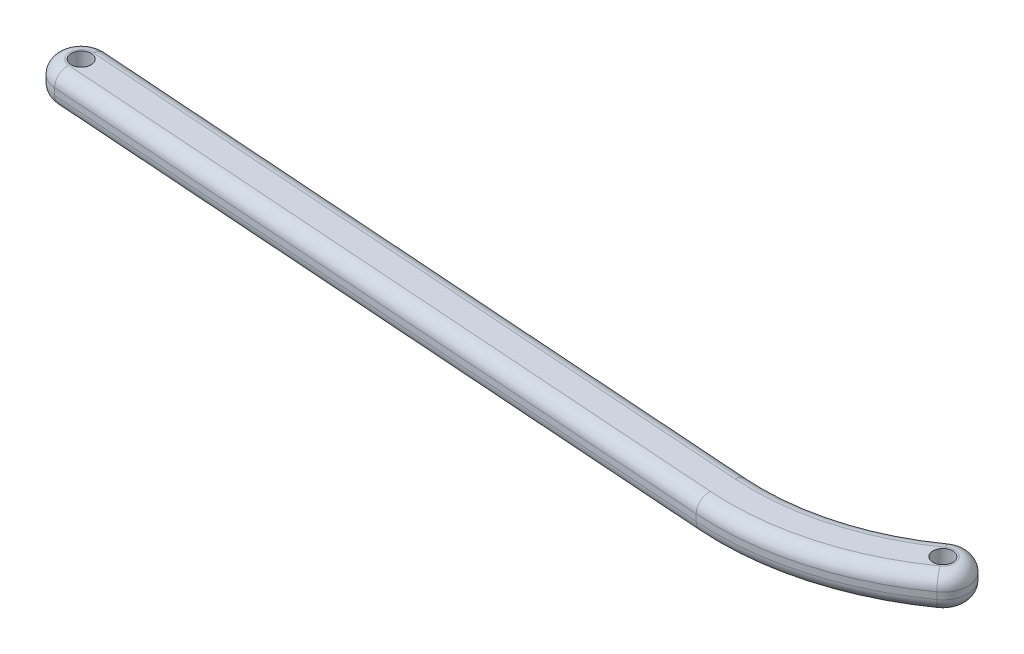
ISO-10303-21;
HEADER;
FILE_DESCRIPTION(('STEP AP214'),'2;1');
FILE_NAME('part.step','',(''),(''),'','','');
FILE_SCHEMA(('AUTOMOTIVE_DESIGN { 1 0 10303 214 1 1 1 1 }'));
ENDSEC;
DATA;
#1=APPLICATION_CONTEXT('core data for automotive mechanical design processes');
#2=APPLICATION_PROTOCOL_DEFINITION('international standard','automotive_design',2000,#1);
#3=PRODUCT_CONTEXT('',#1,'mechanical');
#4=PRODUCT('Part','Part','',(#3));
#5=PRODUCT_RELATED_PRODUCT_CATEGORY('part','',(#4));
#6=PRODUCT_DEFINITION_FORMATION('','',#4);
#7=PRODUCT_DEFINITION_CONTEXT('part definition',#1,'design');
#8=PRODUCT_DEFINITION('design','',#6,#7);
#9=PRODUCT_DEFINITION_SHAPE('','',#8);
#10=(LENGTH_UNIT() NAMED_UNIT(*) SI_UNIT(.MILLI.,.METRE.));
#11=(NAMED_UNIT(*) PLANE_ANGLE_UNIT() SI_UNIT($,.RADIAN.));
#12=(NAMED_UNIT(*) SI_UNIT($,.STERADIAN.) SOLID_ANGLE_UNIT());
#13=UNCERTAINTY_MEASURE_WITH_UNIT(LENGTH_MEASURE(1.E-05),#10,'distance_accuracy_value','');
#14=(GEOMETRIC_REPRESENTATION_CONTEXT(3) GLOBAL_UNCERTAINTY_ASSIGNED_CONTEXT((#13)) GLOBAL_UNIT_ASSIGNED_CONTEXT((#10,
#11,#12)) REPRESENTATION_CONTEXT('',''));
#15=CARTESIAN_POINT('',(0.,0.,0.));
#16=DIRECTION('',(0.,0.,1.));
#17=DIRECTION('',(1.,0.,0.));
#18=AXIS2_PLACEMENT_3D('',#15,#16,#17);
#19=CARTESIAN_POINT('',(0.,5.,0.));
#20=DIRECTION('',(0.,1.,0.));
#21=DIRECTION('',(0.,0.,1.));
#22=AXIS2_PLACEMENT_3D('',#19,#20,#21);
#23=PLANE('',#22);
#24=DIRECTION('',(0.997564050259824,0.,0.0697564737441255));
#25=VECTOR('',#24,1.);
#26=CARTESIAN_POINT('',(-52.1097951829249,5.,18.0456459004256));
#27=LINE('',#26,#25);
#28=CARTESIAN_POINT('',(-260.244147658104,5.,3.49147417590938));
#29=VERTEX_POINT('',#28);
#30=CARTESIAN_POINT('',(-52.1097951829248,5.,18.0456459004256));
#31=VERTEX_POINT('',#30);
#32=EDGE_CURVE('E60',#29,#31,#27,.T.);
#33=ORIENTED_EDGE('',*,*,#32,.T.);
#34=CARTESIAN_POINT('',(-46.2851296252904,5.,-65.2509522962697));
#35=DIRECTION('',(0.,1.,0.));
#36=DIRECTION('',(0.,0.,1.));
#37=AXIS2_PLACEMENT_3D('',#34,#35,#36);
#38=CIRCLE('',#37,83.5);
#39=CARTESIAN_POINT('',(2.02497442110648,5.,2.8547291629618));
#40=VERTEX_POINT('',#39);
#41=EDGE_CURVE('E143',#31,#40,#38,.T.);
#42=ORIENTED_EDGE('',*,*,#41,.T.);
#43=CARTESIAN_POINT('',(0.,5.,0.));
#44=DIRECTION('',(0.,1.,0.));
#45=DIRECTION('',(0.,0.,1.));
#46=AXIS2_PLACEMENT_3D('',#43,#44,#45);
#47=CIRCLE('',#46,3.50000000000001);
#48=CARTESIAN_POINT('',(-2.02497442110647,5.,-2.8547291629618));
#49=VERTEX_POINT('',#48);
#50=EDGE_CURVE('E167',#40,#49,#47,.T.);
#51=ORIENTED_EDGE('',*,*,#50,.T.);
#52=CARTESIAN_POINT('',(-46.2851296252904,5.,-65.2509522962697));
#53=DIRECTION('',(0.,1.,0.));
#54=DIRECTION('',(0.,0.,1.));
#55=AXIS2_PLACEMENT_3D('',#52,#53,#54);
#56=CIRCLE('',#55,76.5);
#57=CARTESIAN_POINT('',(-51.6214998667159,5.,11.0626975486069));
#58=VERTEX_POINT('',#57);
#59=EDGE_CURVE('E269',#49,#58,#56,.F.);
#60=ORIENTED_EDGE('',*,*,#59,.T.);
#61=DIRECTION('',(-0.997564050259824,0.,-0.0697564737441254));
#62=VECTOR('',#61,1.);
#63=CARTESIAN_POINT('',(-259.755852341896,5.,-3.49147417590938));
#64=LINE('',#63,#62);
#65=CARTESIAN_POINT('',(-259.755852341896,5.,-3.49147417590938));
#66=VERTEX_POINT('',#65);
#67=EDGE_CURVE('E271',#58,#66,#64,.T.);
#68=ORIENTED_EDGE('',*,*,#67,.T.);
#69=CARTESIAN_POINT('',(-260.,5.,0.));
#70=DIRECTION('',(0.,1.,0.));
#71=DIRECTION('',(0.,0.,1.));
#72=AXIS2_PLACEMENT_3D('',#69,#70,#71);
#73=CIRCLE('',#72,3.49999999999999);
#74=EDGE_CURVE('E65',#66,#29,#73,.T.);
#75=ORIENTED_EDGE('',*,*,#74,.T.);
#76=EDGE_LOOP('',(#33,#42,#51,#60,#68,#75));
#77=FACE_BOUND('',#76,.T.);
#78=CARTESIAN_POINT('',(0.,5.,0.));
#79=DIRECTION('',(0.,1.,0.));
#80=DIRECTION('',(0.,0.,1.));
#81=AXIS2_PLACEMENT_3D('',#78,#79,#80);
#82=CIRCLE('',#81,3.);
#83=CARTESIAN_POINT('',(0.,5.,3.));
#84=VERTEX_POINT('',#83);
#85=EDGE_CURVE('E156',#84,#84,#82,.T.);
#86=ORIENTED_EDGE('',*,*,#85,.F.);
#87=EDGE_LOOP('',(#86));
#88=FACE_BOUND('',#87,.T.);
#89=CARTESIAN_POINT('',(-260.,5.,0.));
#90=DIRECTION('',(0.,1.,0.));
#91=DIRECTION('',(0.,0.,1.));
#92=AXIS2_PLACEMENT_3D('',#89,#90,#91);
#93=CIRCLE('',#92,2.99999999999999);
#94=CARTESIAN_POINT('',(-260.,5.,2.99999999999999));
#95=VERTEX_POINT('',#94);
#96=EDGE_CURVE('E215',#95,#95,#93,.T.);
#97=ORIENTED_EDGE('',*,*,#96,.F.);
#98=EDGE_LOOP('',(#97));
#99=FACE_BOUND('',#98,.T.);
#100=ADVANCED_FACE('F43',(#77,#88,#99),#23,.T.);
#101=CARTESIAN_POINT('',(0.,-5.,0.));
#102=DIRECTION('',(0.,1.,0.));
#103=DIRECTION('',(0.,0.,1.));
#104=AXIS2_PLACEMENT_3D('',#101,#102,#103);
#105=PLANE('',#104);
#106=CARTESIAN_POINT('',(0.,-5.,0.));
#107=DIRECTION('',(0.,1.,0.));
#108=DIRECTION('',(0.,0.,1.));
#109=AXIS2_PLACEMENT_3D('',#106,#107,#108);
#110=CIRCLE('',#109,3.50000000000001);
#111=CARTESIAN_POINT('',(-2.02497442110647,-5.,-2.8547291629618));
#112=VERTEX_POINT('',#111);
#113=CARTESIAN_POINT('',(2.02497442110648,-5.,2.8547291629618));
#114=VERTEX_POINT('',#113);
#115=EDGE_CURVE('E239',#112,#114,#110,.F.);
#116=ORIENTED_EDGE('',*,*,#115,.T.);
#117=CARTESIAN_POINT('',(-46.2851296252904,-5.,-65.2509522962697));
#118=DIRECTION('',(0.,1.,0.));
#119=DIRECTION('',(0.,0.,1.));
#120=AXIS2_PLACEMENT_3D('',#117,#118,#119);
#121=CIRCLE('',#120,83.5);
#122=CARTESIAN_POINT('',(-52.1097951829248,-5.,18.0456459004256));
#123=VERTEX_POINT('',#122);
#124=EDGE_CURVE('E249',#114,#123,#121,.F.);
#125=ORIENTED_EDGE('',*,*,#124,.T.);
#126=DIRECTION('',(0.997564050259824,0.,0.0697564737441255));
#127=VECTOR('',#126,1.);
#128=CARTESIAN_POINT('',(-1.50929872170031,-5.,21.5839773007179));
#129=LINE('',#128,#127);
#130=CARTESIAN_POINT('',(-260.244147658104,-5.,3.49147417590938));
#131=VERTEX_POINT('',#130);
#132=EDGE_CURVE('E247',#123,#131,#129,.F.);
#133=ORIENTED_EDGE('',*,*,#132,.T.);
#134=CARTESIAN_POINT('',(-260.,-5.,0.));
#135=DIRECTION('',(0.,1.,0.));
#136=DIRECTION('',(0.,0.,1.));
#137=AXIS2_PLACEMENT_3D('',#134,#135,#136);
#138=CIRCLE('',#137,3.49999999999999);
#139=CARTESIAN_POINT('',(-259.755852341896,-5.,-3.49147417590938));
#140=VERTEX_POINT('',#139);
#141=EDGE_CURVE('E245',#131,#140,#138,.F.);
#142=ORIENTED_EDGE('',*,*,#141,.T.);
#143=DIRECTION('',(-0.997564050259824,0.,-0.0697564737441254));
#144=VECTOR('',#143,1.);
#145=CARTESIAN_POINT('',(-1.02100340549142,-5.,14.6010289488992));
#146=LINE('',#145,#144);
#147=CARTESIAN_POINT('',(-51.6214998667159,-5.,11.0626975486069));
#148=VERTEX_POINT('',#147);
#149=EDGE_CURVE('E243',#140,#148,#146,.F.);
#150=ORIENTED_EDGE('',*,*,#149,.T.);
#151=CARTESIAN_POINT('',(-46.2851296252904,-5.,-65.2509522962697));
#152=DIRECTION('',(0.,1.,0.));
#153=DIRECTION('',(0.,0.,1.));
#154=AXIS2_PLACEMENT_3D('',#151,#152,#153);
#155=CIRCLE('',#154,76.5);
#156=EDGE_CURVE('E241',#148,#112,#155,.T.);
#157=ORIENTED_EDGE('',*,*,#156,.T.);
#158=EDGE_LOOP('',(#116,#125,#133,#142,#150,#157));
#159=FACE_BOUND('',#158,.T.);
#160=CARTESIAN_POINT('',(0.,-5.,0.));
#161=DIRECTION('',(0.,1.,0.));
#162=DIRECTION('',(0.,0.,1.));
#163=AXIS2_PLACEMENT_3D('',#160,#161,#162);
#164=CIRCLE('',#163,3.);
#165=CARTESIAN_POINT('',(0.,-5.,3.));
#166=VERTEX_POINT('',#165);
#167=EDGE_CURVE('E220',#166,#166,#164,.T.);
#168=ORIENTED_EDGE('',*,*,#167,.T.);
#169=EDGE_LOOP('',(#168));
#170=FACE_BOUND('',#169,.T.);
#171=CARTESIAN_POINT('',(-260.,-5.,0.));
#172=DIRECTION('',(0.,1.,0.));
#173=DIRECTION('',(0.,0.,1.));
#174=AXIS2_PLACEMENT_3D('',#171,#172,#173);
#175=CIRCLE('',#174,2.99999999999999);
#176=CARTESIAN_POINT('',(-260.,-5.,2.99999999999999));
#177=VERTEX_POINT('',#176);
#178=EDGE_CURVE('E209',#177,#177,#175,.T.);
#179=ORIENTED_EDGE('',*,*,#178,.T.);
#180=EDGE_LOOP('',(#179));
#181=FACE_BOUND('',#180,.T.);
#182=ADVANCED_FACE('F313',(#159,#170,#181),#105,.F.);
#183=CARTESIAN_POINT('',(0.,5.,0.));
#184=DIRECTION('',(0.,-1.,0.));
#185=DIRECTION('',(0.,0.,-1.));
#186=AXIS2_PLACEMENT_3D('',#183,#184,#185);
#187=CYLINDRICAL_SURFACE('',#186,7.50000000000001);
#188=DIRECTION('',(0.,-1.,0.));
#189=VECTOR('',#188,1.);
#190=CARTESIAN_POINT('',(4.33923090237101,5.,6.11727677777531));
#191=LINE('',#190,#189);
#192=CARTESIAN_POINT('',(4.33923090237101,1.,6.11727677777531));
#193=VERTEX_POINT('',#192);
#194=CARTESIAN_POINT('',(4.33923090237101,-1.,6.11727677777531));
#195=VERTEX_POINT('',#194);
#196=EDGE_CURVE('E136',#193,#195,#191,.T.);
#197=ORIENTED_EDGE('',*,*,#196,.T.);
#198=CARTESIAN_POINT('',(0.,-1.,0.));
#199=DIRECTION('',(0.,1.,0.));
#200=DIRECTION('',(0.,0.,1.));
#201=AXIS2_PLACEMENT_3D('',#198,#199,#200);
#202=CIRCLE('',#201,7.50000000000001);
#203=CARTESIAN_POINT('',(-4.33923090237097,-1.,-6.11727677777527));
#204=VERTEX_POINT('',#203);
#205=EDGE_CURVE('E11',#195,#204,#202,.T.);
#206=ORIENTED_EDGE('',*,*,#205,.T.);
#207=DIRECTION('',(0.,-1.,0.));
#208=VECTOR('',#207,1.);
#209=CARTESIAN_POINT('',(-4.33923090237097,5.,-6.11727677777527));
#210=LINE('',#209,#208);
#211=CARTESIAN_POINT('',(-4.33923090237097,1.,-6.11727677777527));
#212=VERTEX_POINT('',#211);
#213=EDGE_CURVE('E138',#212,#204,#210,.T.);
#214=ORIENTED_EDGE('',*,*,#213,.F.);
#215=CARTESIAN_POINT('',(0.,1.,0.));
#216=DIRECTION('',(0.,1.,0.));
#217=DIRECTION('',(0.,0.,1.));
#218=AXIS2_PLACEMENT_3D('',#215,#216,#217);
#219=CIRCLE('',#218,7.50000000000001);
#220=EDGE_CURVE('E52',#212,#193,#219,.F.);
#221=ORIENTED_EDGE('',*,*,#220,.T.);
#222=EDGE_LOOP('',(#197,#206,#214,#221));
#223=FACE_BOUND('',#222,.T.);
#224=ADVANCED_FACE('F135',(#223),#187,.T.);
#225=CARTESIAN_POINT('',(-46.2851296252904,5.,-65.2509522962697));
#226=DIRECTION('',(0.,-1.,0.));
#227=DIRECTION('',(0.,0.,-1.));
#228=AXIS2_PLACEMENT_3D('',#225,#226,#227);
#229=CYLINDRICAL_SURFACE('',#228,72.5);
#230=ORIENTED_EDGE('',*,*,#213,.T.);
#231=CARTESIAN_POINT('',(-46.2851296252904,-1.,-65.2509522962697));
#232=DIRECTION('',(0.,1.,0.));
#233=DIRECTION('',(0.,0.,1.));
#234=AXIS2_PLACEMENT_3D('',#231,#232,#233);
#235=CIRCLE('',#234,72.5);
#236=CARTESIAN_POINT('',(-51.3424739717394,-1.,7.07244134756756));
#237=VERTEX_POINT('',#236);
#238=EDGE_CURVE('E266',#204,#237,#235,.F.);
#239=ORIENTED_EDGE('',*,*,#238,.T.);
#240=DIRECTION('',(0.,-1.,0.));
#241=VECTOR('',#240,1.);
#242=CARTESIAN_POINT('',(-51.3424739717394,5.,7.07244134756756));
#243=LINE('',#242,#241);
#244=CARTESIAN_POINT('',(-51.3424739717394,1.,7.07244134756756));
#245=VERTEX_POINT('',#244);
#246=EDGE_CURVE('E234',#245,#237,#243,.T.);
#247=ORIENTED_EDGE('',*,*,#246,.F.);
#248=CARTESIAN_POINT('',(-46.2851296252904,1.,-65.2509522962697));
#249=DIRECTION('',(0.,1.,0.));
#250=DIRECTION('',(0.,0.,1.));
#251=AXIS2_PLACEMENT_3D('',#248,#249,#250);
#252=CIRCLE('',#251,72.5);
#253=EDGE_CURVE('E264',#245,#212,#252,.T.);
#254=ORIENTED_EDGE('',*,*,#253,.T.);
#255=EDGE_LOOP('',(#230,#239,#247,#254));
#256=FACE_BOUND('',#255,.T.);
#257=ADVANCED_FACE('F280',(#256),#229,.F.);
#258=CARTESIAN_POINT('',(-51.3424739717395,5.,7.07244134756754));
#259=DIRECTION('',(-0.0697564737441254,0.,0.997564050259824));
#260=DIRECTION('',(0.997564050259824,0.,0.0697564737441254));
#261=AXIS2_PLACEMENT_3D('',#258,#259,#260);
#262=PLANE('',#261);
#263=ORIENTED_EDGE('',*,*,#246,.T.);
#264=DIRECTION('',(-0.997564050259824,0.,-0.0697564737441254));
#265=VECTOR('',#264,1.);
#266=CARTESIAN_POINT('',(-51.3424739717395,-1.,7.07244134756754));
#267=LINE('',#266,#265);
#268=CARTESIAN_POINT('',(-259.476826446919,-1.,-7.48173037694868));
#269=VERTEX_POINT('',#268);
#270=EDGE_CURVE('E262',#237,#269,#267,.T.);
#271=ORIENTED_EDGE('',*,*,#270,.T.);
#272=DIRECTION('',(0.,-1.,0.));
#273=VECTOR('',#272,1.);
#274=CARTESIAN_POINT('',(-259.476826446919,5.,-7.48173037694868));
#275=LINE('',#274,#273);
#276=CARTESIAN_POINT('',(-259.476826446919,1.,-7.48173037694868));
#277=VERTEX_POINT('',#276);
#278=EDGE_CURVE('E231',#277,#269,#275,.T.);
#279=ORIENTED_EDGE('',*,*,#278,.F.);
#280=DIRECTION('',(-0.997564050259824,0.,-0.0697564737441254));
#281=VECTOR('',#280,1.);
#282=CARTESIAN_POINT('',(-51.3424739717394,1.,7.07244134756754));
#283=LINE('',#282,#281);
#284=EDGE_CURVE('E260',#277,#245,#283,.F.);
#285=ORIENTED_EDGE('',*,*,#284,.T.);
#286=EDGE_LOOP('',(#263,#271,#279,#285));
#287=FACE_BOUND('',#286,.T.);
#288=ADVANCED_FACE('F331',(#287),#262,.F.);
#289=CARTESIAN_POINT('',(-260.,5.,0.));
#290=DIRECTION('',(0.,-1.,0.));
#291=DIRECTION('',(0.,0.,-1.));
#292=AXIS2_PLACEMENT_3D('',#289,#290,#291);
#293=CYLINDRICAL_SURFACE('',#292,7.49999999999999);
#294=ORIENTED_EDGE('',*,*,#278,.T.);
#295=CARTESIAN_POINT('',(-260.,-1.,0.));
#296=DIRECTION('',(0.,1.,0.));
#297=DIRECTION('',(0.,0.,1.));
#298=AXIS2_PLACEMENT_3D('',#295,#296,#297);
#299=CIRCLE('',#298,7.49999999999999);
#300=CARTESIAN_POINT('',(-260.523173553081,-1.,7.48173037694868));
#301=VERTEX_POINT('',#300);
#302=EDGE_CURVE('E258',#269,#301,#299,.T.);
#303=ORIENTED_EDGE('',*,*,#302,.T.);
#304=DIRECTION('',(0.,-1.,0.));
#305=VECTOR('',#304,1.);
#306=CARTESIAN_POINT('',(-260.523173553081,5.,7.48173037694868));
#307=LINE('',#306,#305);
#308=CARTESIAN_POINT('',(-260.523173553081,1.,7.48173037694868));
#309=VERTEX_POINT('',#308);
#310=EDGE_CURVE('E228',#309,#301,#307,.T.);
#311=ORIENTED_EDGE('',*,*,#310,.F.);
#312=CARTESIAN_POINT('',(-260.,1.,0.));
#313=DIRECTION('',(0.,1.,0.));
#314=DIRECTION('',(0.,0.,1.));
#315=AXIS2_PLACEMENT_3D('',#312,#313,#314);
#316=CIRCLE('',#315,7.49999999999999);
#317=EDGE_CURVE('E256',#309,#277,#316,.F.);
#318=ORIENTED_EDGE('',*,*,#317,.T.);
#319=EDGE_LOOP('',(#294,#303,#311,#318));
#320=FACE_BOUND('',#319,.T.);
#321=ADVANCED_FACE('F293',(#320),#293,.T.);
#322=CARTESIAN_POINT('',(-52.3888210779013,5.,22.0359021014649));
#323=DIRECTION('',(0.0697564737441255,0.,-0.997564050259824));
#324=DIRECTION('',(-0.997564050259824,0.,-0.0697564737441255));
#325=AXIS2_PLACEMENT_3D('',#322,#323,#324);
#326=PLANE('',#325);
#327=ORIENTED_EDGE('',*,*,#310,.T.);
#328=DIRECTION('',(0.997564050259824,0.,0.0697564737441255));
#329=VECTOR('',#328,1.);
#330=CARTESIAN_POINT('',(-52.3888210779013,-1.,22.0359021014649));
#331=LINE('',#330,#329);
#332=CARTESIAN_POINT('',(-52.3888210779013,-1.,22.0359021014649));
#333=VERTEX_POINT('',#332);
#334=EDGE_CURVE('E254',#301,#333,#331,.T.);
#335=ORIENTED_EDGE('',*,*,#334,.T.);
#336=DIRECTION('',(0.,-1.,0.));
#337=VECTOR('',#336,1.);
#338=CARTESIAN_POINT('',(-52.3888210779013,5.,22.0359021014649));
#339=LINE('',#338,#337);
#340=CARTESIAN_POINT('',(-52.3888210779013,1.,22.0359021014649));
#341=VERTEX_POINT('',#340);
#342=EDGE_CURVE('E155',#341,#333,#339,.T.);
#343=ORIENTED_EDGE('',*,*,#342,.F.);
#344=DIRECTION('',(0.997564050259824,0.,0.0697564737441255));
#345=VECTOR('',#344,1.);
#346=CARTESIAN_POINT('',(-260.523173553081,1.,7.48173037694867));
#347=LINE('',#346,#345);
#348=EDGE_CURVE('E252',#341,#309,#347,.F.);
#349=ORIENTED_EDGE('',*,*,#348,.T.);
#350=EDGE_LOOP('',(#327,#335,#343,#349));
#351=FACE_BOUND('',#350,.T.);
#352=ADVANCED_FACE('F290',(#351),#326,.F.);
#353=CARTESIAN_POINT('',(-46.2851296252904,5.,-65.2509522962697));
#354=DIRECTION('',(0.,-1.,0.));
#355=DIRECTION('',(0.,0.,-1.));
#356=AXIS2_PLACEMENT_3D('',#353,#354,#355);
#357=CYLINDRICAL_SURFACE('',#356,87.5000000000001);
#358=ORIENTED_EDGE('',*,*,#342,.T.);
#359=CARTESIAN_POINT('',(-46.2851296252904,-1.,-65.2509522962697));
#360=DIRECTION('',(0.,1.,0.));
#361=DIRECTION('',(0.,0.,1.));
#362=AXIS2_PLACEMENT_3D('',#359,#360,#361);
#363=CIRCLE('',#362,87.5000000000001);
#364=EDGE_CURVE('E154',#333,#195,#363,.T.);
#365=ORIENTED_EDGE('',*,*,#364,.T.);
#366=ORIENTED_EDGE('',*,*,#196,.F.);
#367=CARTESIAN_POINT('',(-46.2851296252904,1.,-65.2509522962697));
#368=DIRECTION('',(0.,1.,0.));
#369=DIRECTION('',(0.,0.,1.));
#370=AXIS2_PLACEMENT_3D('',#367,#368,#369);
#371=CIRCLE('',#370,87.5000000000001);
#372=EDGE_CURVE('E151',#193,#341,#371,.F.);
#373=ORIENTED_EDGE('',*,*,#372,.T.);
#374=EDGE_LOOP('',(#358,#365,#366,#373));
#375=FACE_BOUND('',#374,.T.);
#376=ADVANCED_FACE('F150',(#375),#357,.T.);
#377=CARTESIAN_POINT('',(0.,5.,0.));
#378=DIRECTION('',(0.,-1.,0.));
#379=DIRECTION('',(0.,0.,-1.));
#380=AXIS2_PLACEMENT_3D('',#377,#378,#379);
#381=CYLINDRICAL_SURFACE('',#380,3.);
#382=ORIENTED_EDGE('',*,*,#85,.T.);
#383=EDGE_LOOP('',(#382));
#384=FACE_BOUND('',#383,.T.);
#385=ORIENTED_EDGE('',*,*,#167,.F.);
#386=EDGE_LOOP('',(#385));
#387=FACE_BOUND('',#386,.T.);
#388=ADVANCED_FACE('F322',(#384,#387),#381,.F.);
#389=CARTESIAN_POINT('',(-260.,5.,0.));
#390=DIRECTION('',(0.,-1.,0.));
#391=DIRECTION('',(0.,0.,-1.));
#392=AXIS2_PLACEMENT_3D('',#389,#390,#391);
#393=CYLINDRICAL_SURFACE('',#392,2.99999999999999);
#394=ORIENTED_EDGE('',*,*,#96,.T.);
#395=EDGE_LOOP('',(#394));
#396=FACE_BOUND('',#395,.T.);
#397=ORIENTED_EDGE('',*,*,#178,.F.);
#398=EDGE_LOOP('',(#397));
#399=FACE_BOUND('',#398,.T.);
#400=ADVANCED_FACE('F374',(#396,#399),#393,.F.);
#401=CARTESIAN_POINT('',(-51.621499866716,-1.,11.0626975486068));
#402=DIRECTION('',(-0.997564050259824,0.,-0.0697564737441254));
#403=DIRECTION('',(-0.0697564737441254,0.,0.997564050259824));
#404=AXIS2_PLACEMENT_3D('',#401,#402,#403);
#405=CYLINDRICAL_SURFACE('',#404,4.);
#406=CARTESIAN_POINT('',(-51.6214998667159,-1.,11.0626975486068));
#407=DIRECTION('',(0.997564050259824,0.,0.0697564737441262));
#408=DIRECTION('',(0.0697564737441262,0.,-0.997564050259824));
#409=AXIS2_PLACEMENT_3D('',#406,#407,#408);
#410=CIRCLE('',#409,4.);
#411=EDGE_CURVE('E202',#148,#237,#410,.T.);
#412=ORIENTED_EDGE('',*,*,#411,.F.);
#413=ORIENTED_EDGE('',*,*,#149,.F.);
#414=CARTESIAN_POINT('',(-259.755852341896,-1.,-3.49147417590938));
#415=DIRECTION('',(-0.997564050259824,0.,-0.0697564737441314));
#416=DIRECTION('',(-0.0697564737441314,0.,0.997564050259824));
#417=AXIS2_PLACEMENT_3D('',#414,#415,#416);
#418=CIRCLE('',#417,4.);
#419=EDGE_CURVE('E172',#269,#140,#418,.T.);
#420=ORIENTED_EDGE('',*,*,#419,.F.);
#421=ORIENTED_EDGE('',*,*,#270,.F.);
#422=EDGE_LOOP('',(#412,#413,#420,#421));
#423=FACE_BOUND('',#422,.T.);
#424=ADVANCED_FACE('F370',(#423),#405,.T.);
#425=CARTESIAN_POINT('',(-260.,-1.,0.));
#426=DIRECTION('',(0.,1.,0.));
#427=DIRECTION('',(0.,0.,1.));
#428=AXIS2_PLACEMENT_3D('',#425,#426,#427);
#429=DEGENERATE_TOROIDAL_SURFACE('',#428,3.49999999999999,4.,.T.);
#430=ORIENTED_EDGE('',*,*,#419,.T.);
#431=ORIENTED_EDGE('',*,*,#141,.F.);
#432=CARTESIAN_POINT('',(-260.244147658104,-1.,3.49147417590938));
#433=DIRECTION('',(0.997564050259824,0.,0.0697564737441314));
#434=DIRECTION('',(0.0697564737441314,0.,-0.997564050259824));
#435=AXIS2_PLACEMENT_3D('',#432,#433,#434);
#436=CIRCLE('',#435,4.);
#437=EDGE_CURVE('E200',#301,#131,#436,.T.);
#438=ORIENTED_EDGE('',*,*,#437,.F.);
#439=ORIENTED_EDGE('',*,*,#302,.F.);
#440=EDGE_LOOP('',(#430,#431,#438,#439));
#441=FACE_BOUND('',#440,.T.);
#442=ADVANCED_FACE('F295',(#441),#429,.T.);
#443=CARTESIAN_POINT('',(-46.2851296252904,-1.,-65.2509522962697));
#444=DIRECTION('',(0.,1.,0.));
#445=DIRECTION('',(0.,0.,1.));
#446=AXIS2_PLACEMENT_3D('',#443,#444,#445);
#447=TOROIDAL_SURFACE('',#446,76.5,4.);
#448=ORIENTED_EDGE('',*,*,#411,.T.);
#449=ORIENTED_EDGE('',*,*,#238,.F.);
#450=CARTESIAN_POINT('',(-2.02497442110645,-1.,-2.85472916296178));
#451=DIRECTION('',(0.815636903703372,0.,-0.578564120316129));
#452=DIRECTION('',(-0.57856412031613,0.,-0.815636903703372));
#453=AXIS2_PLACEMENT_3D('',#450,#451,#452);
#454=CIRCLE('',#453,4.);
#455=EDGE_CURVE('E195',#112,#204,#454,.T.);
#456=ORIENTED_EDGE('',*,*,#455,.F.);
#457=ORIENTED_EDGE('',*,*,#156,.F.);
#458=EDGE_LOOP('',(#448,#449,#456,#457));
#459=FACE_BOUND('',#458,.T.);
#460=ADVANCED_FACE('F384',(#459),#447,.T.);
#461=CARTESIAN_POINT('',(-52.1097951829248,-1.,18.0456459004256));
#462=DIRECTION('',(0.997564050259824,0.,0.0697564737441255));
#463=DIRECTION('',(0.0697564737441255,0.,-0.997564050259824));
#464=AXIS2_PLACEMENT_3D('',#461,#462,#463);
#465=CYLINDRICAL_SURFACE('',#464,4.);
#466=ORIENTED_EDGE('',*,*,#437,.T.);
#467=ORIENTED_EDGE('',*,*,#132,.F.);
#468=CARTESIAN_POINT('',(-52.1097951829248,-1.,18.0456459004256));
#469=DIRECTION('',(0.997564050259824,0.,0.0697564737441262));
#470=DIRECTION('',(0.0697564737441262,0.,-0.997564050259824));
#471=AXIS2_PLACEMENT_3D('',#468,#469,#470);
#472=CIRCLE('',#471,4.);
#473=EDGE_CURVE('E189',#333,#123,#472,.T.);
#474=ORIENTED_EDGE('',*,*,#473,.F.);
#475=ORIENTED_EDGE('',*,*,#334,.F.);
#476=EDGE_LOOP('',(#466,#467,#474,#475));
#477=FACE_BOUND('',#476,.T.);
#478=ADVANCED_FACE('F300',(#477),#465,.T.);
#479=CARTESIAN_POINT('',(0.,-1.,0.));
#480=DIRECTION('',(0.,1.,0.));
#481=DIRECTION('',(0.,0.,1.));
#482=AXIS2_PLACEMENT_3D('',#479,#480,#481);
#483=DEGENERATE_TOROIDAL_SURFACE('',#482,3.50000000000001,4.,.T.);
#484=ORIENTED_EDGE('',*,*,#455,.T.);
#485=ORIENTED_EDGE('',*,*,#205,.F.);
#486=CARTESIAN_POINT('',(2.02497442110648,-1.,2.8547291629618));
#487=DIRECTION('',(-0.815636903703371,0.,0.57856412031613));
#488=DIRECTION('',(0.57856412031613,0.,0.815636903703371));
#489=AXIS2_PLACEMENT_3D('',#486,#487,#488);
#490=CIRCLE('',#489,4.);
#491=EDGE_CURVE('E185',#114,#195,#490,.T.);
#492=ORIENTED_EDGE('',*,*,#491,.F.);
#493=ORIENTED_EDGE('',*,*,#115,.F.);
#494=EDGE_LOOP('',(#484,#485,#492,#493));
#495=FACE_BOUND('',#494,.T.);
#496=ADVANCED_FACE('F303',(#495),#483,.T.);
#497=CARTESIAN_POINT('',(-46.2851296252904,-1.,-65.2509522962697));
#498=DIRECTION('',(0.,1.,0.));
#499=DIRECTION('',(0.,0.,1.));
#500=AXIS2_PLACEMENT_3D('',#497,#498,#499);
#501=TOROIDAL_SURFACE('',#500,83.5,4.);
#502=ORIENTED_EDGE('',*,*,#473,.T.);
#503=ORIENTED_EDGE('',*,*,#124,.F.);
#504=ORIENTED_EDGE('',*,*,#491,.T.);
#505=ORIENTED_EDGE('',*,*,#364,.F.);
#506=EDGE_LOOP('',(#502,#503,#504,#505));
#507=FACE_BOUND('',#506,.T.);
#508=ADVANCED_FACE('F301',(#507),#501,.T.);
#509=CARTESIAN_POINT('',(-1.02100340549142,1.,14.6010289488992));
#510=DIRECTION('',(0.997564050259824,0.,0.0697564737441254));
#511=DIRECTION('',(0.0697564737441254,0.,-0.997564050259824));
#512=AXIS2_PLACEMENT_3D('',#509,#510,#511);
#513=CYLINDRICAL_SURFACE('',#512,4.);
#514=CARTESIAN_POINT('',(-51.6214998667159,1.,11.0626975486068));
#515=DIRECTION('',(0.997564050259824,0.,0.0697564737441262));
#516=DIRECTION('',(0.0697564737441262,0.,-0.997564050259824));
#517=AXIS2_PLACEMENT_3D('',#514,#515,#516);
#518=CIRCLE('',#517,4.);
#519=EDGE_CURVE('E178',#245,#58,#518,.T.);
#520=ORIENTED_EDGE('',*,*,#519,.F.);
#521=ORIENTED_EDGE('',*,*,#284,.F.);
#522=CARTESIAN_POINT('',(-259.755852341896,1.,-3.49147417590938));
#523=DIRECTION('',(-0.997564050259824,0.,-0.0697564737441315));
#524=DIRECTION('',(-0.0697564737441315,0.,0.997564050259824));
#525=AXIS2_PLACEMENT_3D('',#522,#523,#524);
#526=CIRCLE('',#525,4.);
#527=EDGE_CURVE('E47',#66,#277,#526,.T.);
#528=ORIENTED_EDGE('',*,*,#527,.F.);
#529=ORIENTED_EDGE('',*,*,#67,.F.);
#530=EDGE_LOOP('',(#520,#521,#528,#529));
#531=FACE_BOUND('',#530,.T.);
#532=ADVANCED_FACE('F45',(#531),#513,.T.);
#533=CARTESIAN_POINT('',(-260.,1.,0.));
#534=DIRECTION('',(0.,1.,0.));
#535=DIRECTION('',(0.,0.,1.));
#536=AXIS2_PLACEMENT_3D('',#533,#534,#535);
#537=DEGENERATE_TOROIDAL_SURFACE('',#536,3.49999999999999,4.,.T.);
#538=ORIENTED_EDGE('',*,*,#527,.T.);
#539=ORIENTED_EDGE('',*,*,#317,.F.);
#540=CARTESIAN_POINT('',(-260.244147658104,1.,3.49147417590938));
#541=DIRECTION('',(0.997564050259824,0.,0.0697564737441314));
#542=DIRECTION('',(0.0697564737441314,0.,-0.997564050259824));
#543=AXIS2_PLACEMENT_3D('',#540,#541,#542);
#544=CIRCLE('',#543,4.);
#545=EDGE_CURVE('E176',#29,#309,#544,.T.);
#546=ORIENTED_EDGE('',*,*,#545,.F.);
#547=ORIENTED_EDGE('',*,*,#74,.F.);
#548=EDGE_LOOP('',(#538,#539,#546,#547));
#549=FACE_BOUND('',#548,.T.);
#550=ADVANCED_FACE('F285',(#549),#537,.T.);
#551=CARTESIAN_POINT('',(-46.2851296252904,1.,-65.2509522962697));
#552=DIRECTION('',(0.,1.,0.));
#553=DIRECTION('',(0.,0.,1.));
#554=AXIS2_PLACEMENT_3D('',#551,#552,#553);
#555=TOROIDAL_SURFACE('',#554,76.5,4.);
#556=ORIENTED_EDGE('',*,*,#519,.T.);
#557=ORIENTED_EDGE('',*,*,#59,.F.);
#558=CARTESIAN_POINT('',(-2.02497442110645,1.,-2.85472916296178));
#559=DIRECTION('',(0.815636903703372,0.,-0.578564120316129));
#560=DIRECTION('',(-0.57856412031613,0.,-0.815636903703372));
#561=AXIS2_PLACEMENT_3D('',#558,#559,#560);
#562=CIRCLE('',#561,4.);
#563=EDGE_CURVE('E169',#212,#49,#562,.T.);
#564=ORIENTED_EDGE('',*,*,#563,.F.);
#565=ORIENTED_EDGE('',*,*,#253,.F.);
#566=EDGE_LOOP('',(#556,#557,#564,#565));
#567=FACE_BOUND('',#566,.T.);
#568=ADVANCED_FACE('F277',(#567),#555,.T.);
#569=CARTESIAN_POINT('',(-1.50929872170031,1.,21.5839773007179));
#570=DIRECTION('',(-0.997564050259824,0.,-0.0697564737441255));
#571=DIRECTION('',(-0.0697564737441255,0.,0.997564050259824));
#572=AXIS2_PLACEMENT_3D('',#569,#570,#571);
#573=CYLINDRICAL_SURFACE('',#572,4.);
#574=ORIENTED_EDGE('',*,*,#545,.T.);
#575=ORIENTED_EDGE('',*,*,#348,.F.);
#576=CARTESIAN_POINT('',(-52.1097951829248,1.,18.0456459004256));
#577=DIRECTION('',(0.997564050259824,0.,0.0697564737441245));
#578=DIRECTION('',(0.0697564737441245,0.,-0.997564050259824));
#579=AXIS2_PLACEMENT_3D('',#576,#577,#578);
#580=CIRCLE('',#579,4.);
#581=EDGE_CURVE('E163',#31,#341,#580,.T.);
#582=ORIENTED_EDGE('',*,*,#581,.F.);
#583=ORIENTED_EDGE('',*,*,#32,.F.);
#584=EDGE_LOOP('',(#574,#575,#582,#583));
#585=FACE_BOUND('',#584,.T.);
#586=ADVANCED_FACE('F287',(#585),#573,.T.);
#587=CARTESIAN_POINT('',(0.,1.,0.));
#588=DIRECTION('',(0.,1.,0.));
#589=DIRECTION('',(0.,0.,1.));
#590=AXIS2_PLACEMENT_3D('',#587,#588,#589);
#591=DEGENERATE_TOROIDAL_SURFACE('',#590,3.50000000000001,4.,.T.);
#592=ORIENTED_EDGE('',*,*,#563,.T.);
#593=ORIENTED_EDGE('',*,*,#50,.F.);
#594=CARTESIAN_POINT('',(2.02497442110647,1.,2.85472916296181));
#595=DIRECTION('',(-0.81563690370337,0.,0.578564120316132));
#596=DIRECTION('',(0.578564120316132,0.,0.81563690370337));
#597=AXIS2_PLACEMENT_3D('',#594,#595,#596);
#598=CIRCLE('',#597,4.);
#599=EDGE_CURVE('E161',#193,#40,#598,.T.);
#600=ORIENTED_EDGE('',*,*,#599,.F.);
#601=ORIENTED_EDGE('',*,*,#220,.F.);
#602=EDGE_LOOP('',(#592,#593,#600,#601));
#603=FACE_BOUND('',#602,.T.);
#604=ADVANCED_FACE('F166',(#603),#591,.T.);
#605=CARTESIAN_POINT('',(-46.2851296252904,1.,-65.2509522962697));
#606=DIRECTION('',(0.,1.,0.));
#607=DIRECTION('',(0.,0.,1.));
#608=AXIS2_PLACEMENT_3D('',#605,#606,#607);
#609=TOROIDAL_SURFACE('',#608,83.5,4.);
#610=ORIENTED_EDGE('',*,*,#581,.T.);
#611=ORIENTED_EDGE('',*,*,#372,.F.);
#612=ORIENTED_EDGE('',*,*,#599,.T.);
#613=ORIENTED_EDGE('',*,*,#41,.F.);
#614=EDGE_LOOP('',(#610,#611,#612,#613));
#615=FACE_BOUND('',#614,.T.);
#616=ADVANCED_FACE('F159',(#615),#609,.T.);
#617=CLOSED_SHELL('',(#100,#182,#224,#257,#288,#321,#352,#376,#388,#400,#424,#442,#460,#478,
#496,#508,#532,#550,#568,#586,#604,#616));
#618=MANIFOLD_SOLID_BREP('B2',#617);
#619=ADVANCED_BREP_SHAPE_REPRESENTATION('',(#18,#618),#14);
#620=SHAPE_DEFINITION_REPRESENTATION(#9,#619);
ENDSEC;
END-ISO-10303-21;
